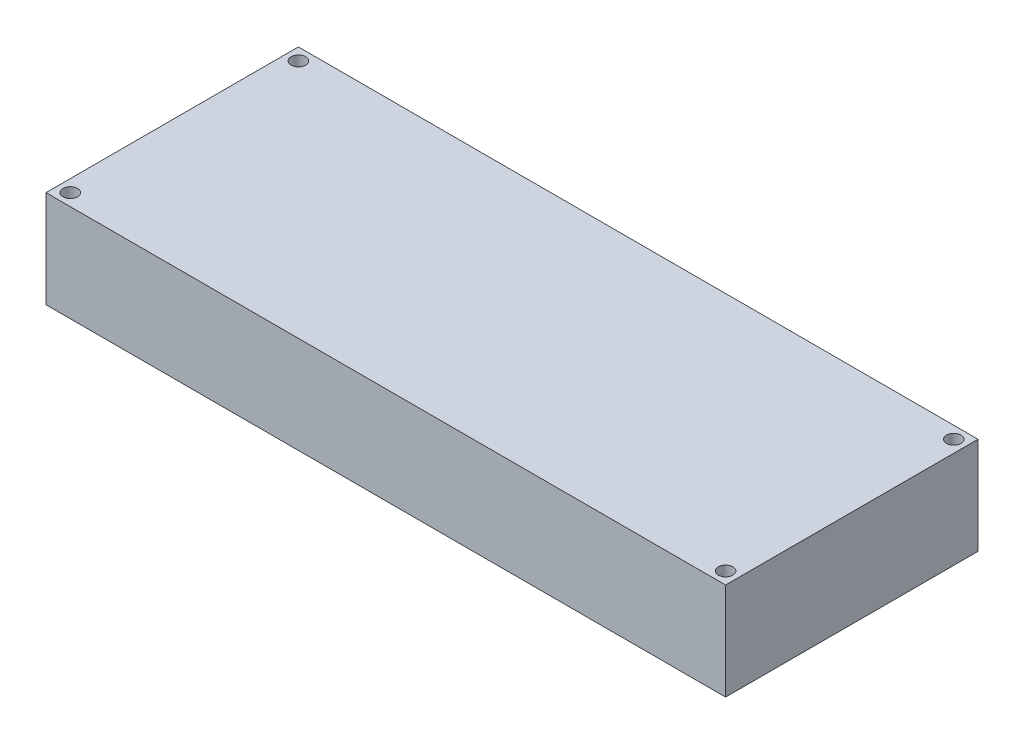
ISO-10303-21;
HEADER;
FILE_DESCRIPTION(('STEP AP214'),'2;1');
FILE_NAME('part.step','',(''),(''),'','','');
FILE_SCHEMA(('AUTOMOTIVE_DESIGN { 1 0 10303 214 1 1 1 1 }'));
ENDSEC;
DATA;
#1=APPLICATION_CONTEXT('core data for automotive mechanical design processes');
#2=APPLICATION_PROTOCOL_DEFINITION('international standard','automotive_design',2000,#1);
#3=PRODUCT_CONTEXT('',#1,'mechanical');
#4=PRODUCT('Part','Part','',(#3));
#5=PRODUCT_RELATED_PRODUCT_CATEGORY('part','',(#4));
#6=PRODUCT_DEFINITION_FORMATION('','',#4);
#7=PRODUCT_DEFINITION_CONTEXT('part definition',#1,'design');
#8=PRODUCT_DEFINITION('design','',#6,#7);
#9=PRODUCT_DEFINITION_SHAPE('','',#8);
#10=(LENGTH_UNIT() NAMED_UNIT(*) SI_UNIT(.MILLI.,.METRE.));
#11=(NAMED_UNIT(*) PLANE_ANGLE_UNIT() SI_UNIT($,.RADIAN.));
#12=(NAMED_UNIT(*) SI_UNIT($,.STERADIAN.) SOLID_ANGLE_UNIT());
#13=UNCERTAINTY_MEASURE_WITH_UNIT(LENGTH_MEASURE(1.E-05),#10,'distance_accuracy_value','');
#14=(GEOMETRIC_REPRESENTATION_CONTEXT(3) GLOBAL_UNCERTAINTY_ASSIGNED_CONTEXT((#13)) GLOBAL_UNIT_ASSIGNED_CONTEXT((#10,
#11,#12)) REPRESENTATION_CONTEXT('',''));
#15=CARTESIAN_POINT('',(0.,0.,0.));
#16=DIRECTION('',(0.,0.,1.));
#17=DIRECTION('',(1.,0.,0.));
#18=AXIS2_PLACEMENT_3D('',#15,#16,#17);
#19=CARTESIAN_POINT('',(0.,20.,0.));
#20=DIRECTION('',(0.,0.,-1.));
#21=DIRECTION('',(-1.,0.,0.));
#22=AXIS2_PLACEMENT_3D('',#19,#20,#21);
#23=PLANE('',#22);
#24=DIRECTION('',(1.,0.,0.));
#25=VECTOR('',#24,1.);
#26=CARTESIAN_POINT('',(0.,0.,0.));
#27=LINE('',#26,#25);
#28=CARTESIAN_POINT('',(0.,0.,0.));
#29=VERTEX_POINT('',#28);
#30=CARTESIAN_POINT('',(140.,0.,0.));
#31=VERTEX_POINT('',#30);
#32=EDGE_CURVE('E131',#29,#31,#27,.T.);
#33=ORIENTED_EDGE('',*,*,#32,.T.);
#34=DIRECTION('',(0.,-1.,0.));
#35=VECTOR('',#34,1.);
#36=CARTESIAN_POINT('',(140.,20.,0.));
#37=LINE('',#36,#35);
#38=CARTESIAN_POINT('',(140.,20.,0.));
#39=VERTEX_POINT('',#38);
#40=EDGE_CURVE('E11',#39,#31,#37,.T.);
#41=ORIENTED_EDGE('',*,*,#40,.F.);
#42=DIRECTION('',(1.,0.,0.));
#43=VECTOR('',#42,1.);
#44=CARTESIAN_POINT('',(0.,20.,0.));
#45=LINE('',#44,#43);
#46=CARTESIAN_POINT('',(0.,20.,0.));
#47=VERTEX_POINT('',#46);
#48=EDGE_CURVE('E97',#47,#39,#45,.T.);
#49=ORIENTED_EDGE('',*,*,#48,.F.);
#50=DIRECTION('',(0.,-1.,0.));
#51=VECTOR('',#50,1.);
#52=CARTESIAN_POINT('',(0.,20.,0.));
#53=LINE('',#52,#51);
#54=EDGE_CURVE('E63',#47,#29,#53,.T.);
#55=ORIENTED_EDGE('',*,*,#54,.T.);
#56=EDGE_LOOP('',(#33,#41,#49,#55));
#57=FACE_BOUND('',#56,.T.);
#58=ADVANCED_FACE('F45',(#57),#23,.F.);
#59=CARTESIAN_POINT('',(140.,20.,0.));
#60=DIRECTION('',(-1.,0.,0.));
#61=DIRECTION('',(0.,0.,1.));
#62=AXIS2_PLACEMENT_3D('',#59,#60,#61);
#63=PLANE('',#62);
#64=DIRECTION('',(0.,0.,-1.));
#65=VECTOR('',#64,1.);
#66=CARTESIAN_POINT('',(140.,0.,0.));
#67=LINE('',#66,#65);
#68=CARTESIAN_POINT('',(140.,0.,-52.));
#69=VERTEX_POINT('',#68);
#70=EDGE_CURVE('E103',#31,#69,#67,.T.);
#71=ORIENTED_EDGE('',*,*,#70,.T.);
#72=DIRECTION('',(0.,-1.,0.));
#73=VECTOR('',#72,1.);
#74=CARTESIAN_POINT('',(140.,20.,-52.));
#75=LINE('',#74,#73);
#76=CARTESIAN_POINT('',(140.,20.,-52.));
#77=VERTEX_POINT('',#76);
#78=EDGE_CURVE('E55',#77,#69,#75,.T.);
#79=ORIENTED_EDGE('',*,*,#78,.F.);
#80=DIRECTION('',(0.,0.,-1.));
#81=VECTOR('',#80,1.);
#82=CARTESIAN_POINT('',(140.,20.,0.));
#83=LINE('',#82,#81);
#84=EDGE_CURVE('E88',#39,#77,#83,.T.);
#85=ORIENTED_EDGE('',*,*,#84,.F.);
#86=ORIENTED_EDGE('',*,*,#40,.T.);
#87=EDGE_LOOP('',(#71,#79,#85,#86));
#88=FACE_BOUND('',#87,.T.);
#89=ADVANCED_FACE('F102',(#88),#63,.F.);
#90=CARTESIAN_POINT('',(0.,20.,-52.));
#91=DIRECTION('',(0.,0.,-1.));
#92=DIRECTION('',(-1.,0.,0.));
#93=AXIS2_PLACEMENT_3D('',#90,#91,#92);
#94=PLANE('',#93);
#95=DIRECTION('',(1.,0.,0.));
#96=VECTOR('',#95,1.);
#97=CARTESIAN_POINT('',(0.,0.,-52.));
#98=LINE('',#97,#96);
#99=CARTESIAN_POINT('',(0.,0.,-52.));
#100=VERTEX_POINT('',#99);
#101=EDGE_CURVE('E136',#100,#69,#98,.T.);
#102=ORIENTED_EDGE('',*,*,#101,.F.);
#103=DIRECTION('',(0.,-1.,0.));
#104=VECTOR('',#103,1.);
#105=CARTESIAN_POINT('',(0.,20.,-52.));
#106=LINE('',#105,#104);
#107=CARTESIAN_POINT('',(0.,20.,-52.));
#108=VERTEX_POINT('',#107);
#109=EDGE_CURVE('E77',#108,#100,#106,.T.);
#110=ORIENTED_EDGE('',*,*,#109,.F.);
#111=DIRECTION('',(1.,0.,0.));
#112=VECTOR('',#111,1.);
#113=CARTESIAN_POINT('',(0.,20.,-52.));
#114=LINE('',#113,#112);
#115=EDGE_CURVE('E96',#108,#77,#114,.T.);
#116=ORIENTED_EDGE('',*,*,#115,.T.);
#117=ORIENTED_EDGE('',*,*,#78,.T.);
#118=EDGE_LOOP('',(#102,#110,#116,#117));
#119=FACE_BOUND('',#118,.T.);
#120=ADVANCED_FACE('F107',(#119),#94,.T.);
#121=CARTESIAN_POINT('',(0.,20.,0.));
#122=DIRECTION('',(-1.,0.,0.));
#123=DIRECTION('',(0.,0.,1.));
#124=AXIS2_PLACEMENT_3D('',#121,#122,#123);
#125=PLANE('',#124);
#126=DIRECTION('',(0.,0.,-1.));
#127=VECTOR('',#126,1.);
#128=CARTESIAN_POINT('',(0.,0.,0.));
#129=LINE('',#128,#127);
#130=EDGE_CURVE('E139',#29,#100,#129,.T.);
#131=ORIENTED_EDGE('',*,*,#130,.F.);
#132=ORIENTED_EDGE('',*,*,#54,.F.);
#133=DIRECTION('',(0.,0.,-1.));
#134=VECTOR('',#133,1.);
#135=CARTESIAN_POINT('',(0.,20.,0.));
#136=LINE('',#135,#134);
#137=EDGE_CURVE('E109',#47,#108,#136,.T.);
#138=ORIENTED_EDGE('',*,*,#137,.T.);
#139=ORIENTED_EDGE('',*,*,#109,.T.);
#140=EDGE_LOOP('',(#131,#132,#138,#139));
#141=FACE_BOUND('',#140,.T.);
#142=ADVANCED_FACE('F195',(#141),#125,.T.);
#143=CARTESIAN_POINT('',(2.5,20.,-49.5));
#144=DIRECTION('',(0.,-1.,0.));
#145=DIRECTION('',(0.,0.,-1.));
#146=AXIS2_PLACEMENT_3D('',#143,#144,#145);
#147=CYLINDRICAL_SURFACE('',#146,1.5);
#148=CARTESIAN_POINT('',(2.5,20.,-49.5));
#149=DIRECTION('',(0.,1.,0.));
#150=DIRECTION('',(0.,0.,1.));
#151=AXIS2_PLACEMENT_3D('',#148,#149,#150);
#152=CIRCLE('',#151,1.5);
#153=CARTESIAN_POINT('',(2.5,20.,-48.));
#154=VERTEX_POINT('',#153);
#155=EDGE_CURVE('E161',#154,#154,#152,.T.);
#156=ORIENTED_EDGE('',*,*,#155,.T.);
#157=EDGE_LOOP('',(#156));
#158=FACE_BOUND('',#157,.T.);
#159=CARTESIAN_POINT('',(2.5,0.,-49.5));
#160=DIRECTION('',(0.,1.,0.));
#161=DIRECTION('',(0.,0.,1.));
#162=AXIS2_PLACEMENT_3D('',#159,#160,#161);
#163=CIRCLE('',#162,1.5);
#164=CARTESIAN_POINT('',(2.5,0.,-48.));
#165=VERTEX_POINT('',#164);
#166=EDGE_CURVE('E127',#165,#165,#163,.T.);
#167=ORIENTED_EDGE('',*,*,#166,.F.);
#168=EDGE_LOOP('',(#167));
#169=FACE_BOUND('',#168,.T.);
#170=ADVANCED_FACE('F169',(#158,#169),#147,.F.);
#171=CARTESIAN_POINT('',(2.5,20.,-2.5));
#172=DIRECTION('',(0.,-1.,0.));
#173=DIRECTION('',(0.,0.,-1.));
#174=AXIS2_PLACEMENT_3D('',#171,#172,#173);
#175=CYLINDRICAL_SURFACE('',#174,1.5);
#176=CARTESIAN_POINT('',(2.5,20.,-2.5));
#177=DIRECTION('',(0.,1.,0.));
#178=DIRECTION('',(0.,0.,1.));
#179=AXIS2_PLACEMENT_3D('',#176,#177,#178);
#180=CIRCLE('',#179,1.5);
#181=CARTESIAN_POINT('',(2.5,20.,-1.));
#182=VERTEX_POINT('',#181);
#183=EDGE_CURVE('E155',#182,#182,#180,.T.);
#184=ORIENTED_EDGE('',*,*,#183,.T.);
#185=EDGE_LOOP('',(#184));
#186=FACE_BOUND('',#185,.T.);
#187=CARTESIAN_POINT('',(2.5,0.,-2.5));
#188=DIRECTION('',(0.,1.,0.));
#189=DIRECTION('',(0.,0.,1.));
#190=AXIS2_PLACEMENT_3D('',#187,#188,#189);
#191=CIRCLE('',#190,1.5);
#192=CARTESIAN_POINT('',(2.5,0.,-1.));
#193=VERTEX_POINT('',#192);
#194=EDGE_CURVE('E123',#193,#193,#191,.T.);
#195=ORIENTED_EDGE('',*,*,#194,.F.);
#196=EDGE_LOOP('',(#195));
#197=FACE_BOUND('',#196,.T.);
#198=ADVANCED_FACE('F194',(#186,#197),#175,.F.);
#199=CARTESIAN_POINT('',(137.5,20.,-2.50000000000003));
#200=DIRECTION('',(0.,-1.,0.));
#201=DIRECTION('',(0.,0.,-1.));
#202=AXIS2_PLACEMENT_3D('',#199,#200,#201);
#203=CYLINDRICAL_SURFACE('',#202,1.5);
#204=CARTESIAN_POINT('',(137.5,20.,-2.50000000000003));
#205=DIRECTION('',(0.,1.,0.));
#206=DIRECTION('',(0.,0.,1.));
#207=AXIS2_PLACEMENT_3D('',#204,#205,#206);
#208=CIRCLE('',#207,1.5);
#209=CARTESIAN_POINT('',(137.5,20.,-1.00000000000003));
#210=VERTEX_POINT('',#209);
#211=EDGE_CURVE('E147',#210,#210,#208,.F.);
#212=ORIENTED_EDGE('',*,*,#211,.F.);
#213=EDGE_LOOP('',(#212));
#214=FACE_BOUND('',#213,.T.);
#215=CARTESIAN_POINT('',(137.5,0.,-2.50000000000003));
#216=DIRECTION('',(0.,1.,0.));
#217=DIRECTION('',(0.,0.,1.));
#218=AXIS2_PLACEMENT_3D('',#215,#216,#217);
#219=CIRCLE('',#218,1.5);
#220=CARTESIAN_POINT('',(137.5,0.,-1.00000000000003));
#221=VERTEX_POINT('',#220);
#222=EDGE_CURVE('E119',#221,#221,#219,.F.);
#223=ORIENTED_EDGE('',*,*,#222,.T.);
#224=EDGE_LOOP('',(#223));
#225=FACE_BOUND('',#224,.T.);
#226=ADVANCED_FACE('F47',(#214,#225),#203,.F.);
#227=CARTESIAN_POINT('',(137.5,20.,-49.5));
#228=DIRECTION('',(0.,-1.,0.));
#229=DIRECTION('',(0.,0.,-1.));
#230=AXIS2_PLACEMENT_3D('',#227,#228,#229);
#231=CYLINDRICAL_SURFACE('',#230,1.5);
#232=CARTESIAN_POINT('',(137.5,20.,-49.5));
#233=DIRECTION('',(0.,1.,0.));
#234=DIRECTION('',(0.,0.,1.));
#235=AXIS2_PLACEMENT_3D('',#232,#233,#234);
#236=CIRCLE('',#235,1.5);
#237=CARTESIAN_POINT('',(137.5,20.,-48.));
#238=VERTEX_POINT('',#237);
#239=EDGE_CURVE('E112',#238,#238,#236,.F.);
#240=ORIENTED_EDGE('',*,*,#239,.F.);
#241=EDGE_LOOP('',(#240));
#242=FACE_BOUND('',#241,.T.);
#243=CARTESIAN_POINT('',(137.5,0.,-49.5));
#244=DIRECTION('',(0.,1.,0.));
#245=DIRECTION('',(0.,0.,1.));
#246=AXIS2_PLACEMENT_3D('',#243,#244,#245);
#247=CIRCLE('',#246,1.5);
#248=CARTESIAN_POINT('',(137.5,0.,-48.));
#249=VERTEX_POINT('',#248);
#250=EDGE_CURVE('E143',#249,#249,#247,.F.);
#251=ORIENTED_EDGE('',*,*,#250,.T.);
#252=EDGE_LOOP('',(#251));
#253=FACE_BOUND('',#252,.T.);
#254=ADVANCED_FACE('F174',(#242,#253),#231,.F.);
#255=CARTESIAN_POINT('',(0.,20.,0.));
#256=DIRECTION('',(0.,1.,0.));
#257=DIRECTION('',(0.,0.,1.));
#258=AXIS2_PLACEMENT_3D('',#255,#256,#257);
#259=PLANE('',#258);
#260=ORIENTED_EDGE('',*,*,#211,.T.);
#261=EDGE_LOOP('',(#260));
#262=FACE_BOUND('',#261,.T.);
#263=ORIENTED_EDGE('',*,*,#183,.F.);
#264=EDGE_LOOP('',(#263));
#265=FACE_BOUND('',#264,.T.);
#266=ORIENTED_EDGE('',*,*,#155,.F.);
#267=EDGE_LOOP('',(#266));
#268=FACE_BOUND('',#267,.T.);
#269=ORIENTED_EDGE('',*,*,#48,.T.);
#270=ORIENTED_EDGE('',*,*,#84,.T.);
#271=ORIENTED_EDGE('',*,*,#115,.F.);
#272=ORIENTED_EDGE('',*,*,#137,.F.);
#273=EDGE_LOOP('',(#269,#270,#271,#272));
#274=FACE_BOUND('',#273,.T.);
#275=ORIENTED_EDGE('',*,*,#239,.T.);
#276=EDGE_LOOP('',(#275));
#277=FACE_BOUND('',#276,.T.);
#278=ADVANCED_FACE('F92',(#262,#265,#268,#274,#277),#259,.T.);
#279=CARTESIAN_POINT('',(0.,0.,0.));
#280=DIRECTION('',(0.,1.,0.));
#281=DIRECTION('',(0.,0.,1.));
#282=AXIS2_PLACEMENT_3D('',#279,#280,#281);
#283=PLANE('',#282);
#284=ORIENTED_EDGE('',*,*,#222,.F.);
#285=EDGE_LOOP('',(#284));
#286=FACE_BOUND('',#285,.T.);
#287=ORIENTED_EDGE('',*,*,#194,.T.);
#288=EDGE_LOOP('',(#287));
#289=FACE_BOUND('',#288,.T.);
#290=ORIENTED_EDGE('',*,*,#166,.T.);
#291=EDGE_LOOP('',(#290));
#292=FACE_BOUND('',#291,.T.);
#293=ORIENTED_EDGE('',*,*,#32,.F.);
#294=ORIENTED_EDGE('',*,*,#130,.T.);
#295=ORIENTED_EDGE('',*,*,#101,.T.);
#296=ORIENTED_EDGE('',*,*,#70,.F.);
#297=EDGE_LOOP('',(#293,#294,#295,#296));
#298=FACE_BOUND('',#297,.T.);
#299=ORIENTED_EDGE('',*,*,#250,.F.);
#300=EDGE_LOOP('',(#299));
#301=FACE_BOUND('',#300,.T.);
#302=ADVANCED_FACE('F173',(#286,#289,#292,#298,#301),#283,.F.);
#303=CLOSED_SHELL('',(#58,#89,#120,#142,#170,#198,#226,#254,#278,#302));
#304=MANIFOLD_SOLID_BREP('B2',#303);
#305=ADVANCED_BREP_SHAPE_REPRESENTATION('',(#18,#304),#14);
#306=SHAPE_DEFINITION_REPRESENTATION(#9,#305);
ENDSEC;
END-ISO-10303-21;
